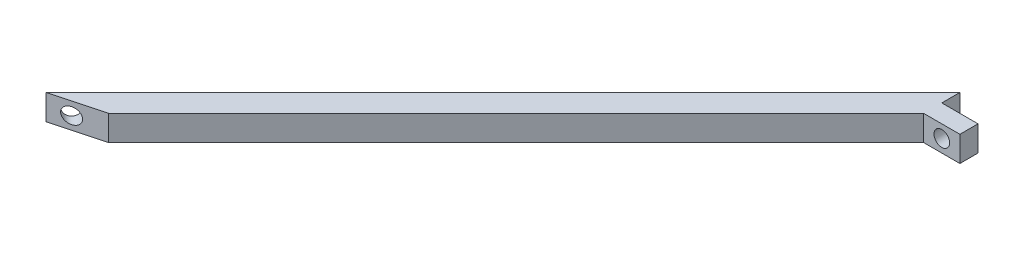
ISO-10303-21;
HEADER;
FILE_DESCRIPTION(('STEP AP214'),'2;1');
FILE_NAME('part.step','',(''),(''),'','','');
FILE_SCHEMA(('AUTOMOTIVE_DESIGN { 1 0 10303 214 1 1 1 1 }'));
ENDSEC;
DATA;
#1=APPLICATION_CONTEXT('core data for automotive mechanical design processes');
#2=APPLICATION_PROTOCOL_DEFINITION('international standard','automotive_design',2000,#1);
#3=PRODUCT_CONTEXT('',#1,'mechanical');
#4=PRODUCT('Part','Part','',(#3));
#5=PRODUCT_RELATED_PRODUCT_CATEGORY('part','',(#4));
#6=PRODUCT_DEFINITION_FORMATION('','',#4);
#7=PRODUCT_DEFINITION_CONTEXT('part definition',#1,'design');
#8=PRODUCT_DEFINITION('design','',#6,#7);
#9=PRODUCT_DEFINITION_SHAPE('','',#8);
#10=(LENGTH_UNIT() NAMED_UNIT(*) SI_UNIT(.MILLI.,.METRE.));
#11=(NAMED_UNIT(*) PLANE_ANGLE_UNIT() SI_UNIT($,.RADIAN.));
#12=(NAMED_UNIT(*) SI_UNIT($,.STERADIAN.) SOLID_ANGLE_UNIT());
#13=UNCERTAINTY_MEASURE_WITH_UNIT(LENGTH_MEASURE(1.E-05),#10,'distance_accuracy_value','');
#14=(GEOMETRIC_REPRESENTATION_CONTEXT(3) GLOBAL_UNCERTAINTY_ASSIGNED_CONTEXT((#13)) GLOBAL_UNIT_ASSIGNED_CONTEXT((#10,
#11,#12)) REPRESENTATION_CONTEXT('',''));
#15=CARTESIAN_POINT('',(0.,0.,0.));
#16=DIRECTION('',(0.,0.,1.));
#17=DIRECTION('',(1.,0.,0.));
#18=AXIS2_PLACEMENT_3D('',#15,#16,#17);
#19=CARTESIAN_POINT('',(-147.271192020746,-0.00999999999999959,110.472946406711));
#20=DIRECTION('',(0.258819045102527,0.,0.965925826289067));
#21=DIRECTION('',(0.965925826289067,0.,-0.258819045102527));
#22=AXIS2_PLACEMENT_3D('',#19,#20,#21);
#23=PLANE('',#22);
#24=DIRECTION('',(0.,-1.,0.));
#25=VECTOR('',#24,1.);
#26=CARTESIAN_POINT('',(-147.271192020746,7.,110.472946406711));
#27=LINE('',#26,#25);
#28=CARTESIAN_POINT('',(-147.271192020746,7.,110.472946406711));
#29=VERTEX_POINT('',#28);
#30=CARTESIAN_POINT('',(-147.271192020746,0.,110.472946406711));
#31=VERTEX_POINT('',#30);
#32=EDGE_CURVE('E113',#29,#31,#27,.T.);
#33=ORIENTED_EDGE('',*,*,#32,.T.);
#34=DIRECTION('',(0.965925826289067,0.,-0.258819045102527));
#35=VECTOR('',#34,1.);
#36=CARTESIAN_POINT('',(17.752937359096,0.,66.2548642077321));
#37=LINE('',#36,#35);
#38=CARTESIAN_POINT('',(-133.610937982901,0.,106.812692368866));
#39=VERTEX_POINT('',#38);
#40=EDGE_CURVE('E138',#31,#39,#37,.T.);
#41=ORIENTED_EDGE('',*,*,#40,.T.);
#42=DIRECTION('',(0.,-1.,0.));
#43=VECTOR('',#42,1.);
#44=CARTESIAN_POINT('',(-133.610937982901,7.,106.812692368866));
#45=LINE('',#44,#43);
#46=CARTESIAN_POINT('',(-133.610937982901,7.,106.812692368866));
#47=VERTEX_POINT('',#46);
#48=EDGE_CURVE('E132',#47,#39,#45,.T.);
#49=ORIENTED_EDGE('',*,*,#48,.F.);
#50=DIRECTION('',(0.965925826289067,0.,-0.258819045102527));
#51=VECTOR('',#50,1.);
#52=CARTESIAN_POINT('',(17.752937359096,7.,66.2548642077321));
#53=LINE('',#52,#51);
#54=EDGE_CURVE('E135',#29,#47,#53,.T.);
#55=ORIENTED_EDGE('',*,*,#54,.F.);
#56=EDGE_LOOP('',(#33,#41,#49,#55));
#57=FACE_BOUND('',#56,.T.);
#58=CARTESIAN_POINT('',(-141.694416662494,3.5,108.978653953098));
#59=DIRECTION('',(0.258819045102527,0.,0.965925826289067));
#60=DIRECTION('',(-0.965925826289067,0.,0.258819045102527));
#61=AXIS2_PLACEMENT_3D('',#58,#59,#60);
#62=ELLIPSE('',#61,2.4826061575154,2.15000000000001);
#63=CARTESIAN_POINT('',(-144.092430066542,3.5,109.621199708151));
#64=VERTEX_POINT('',#63);
#65=EDGE_CURVE('E141',#64,#64,#62,.F.);
#66=ORIENTED_EDGE('',*,*,#65,.T.);
#67=EDGE_LOOP('',(#66));
#68=FACE_BOUND('',#67,.T.);
#69=ADVANCED_FACE('F41',(#57,#68),#23,.T.);
#70=CARTESIAN_POINT('',(-18.3991228070176,7.,-18.3991228070176));
#71=DIRECTION('',(0.707106781186547,0.,0.707106781186547));
#72=DIRECTION('',(0.707106781186548,0.,-0.707106781186548));
#73=AXIS2_PLACEMENT_3D('',#70,#71,#72);
#74=PLANE('',#73);
#75=CARTESIAN_POINT('',(-143.735658114813,3.5,106.937412500778));
#76=DIRECTION('',(-0.707106781186548,0.,-0.707106781186547));
#77=DIRECTION('',(-0.707106781186547,0.,0.707106781186548));
#78=AXIS2_PLACEMENT_3D('',#75,#76,#77);
#79=CIRCLE('',#78,2.15000000000001);
#80=CARTESIAN_POINT('',(-145.255937694364,3.5,108.457692080329));
#81=VERTEX_POINT('',#80);
#82=EDGE_CURVE('E11',#81,#81,#79,.T.);
#83=ORIENTED_EDGE('',*,*,#82,.F.);
#84=EDGE_LOOP('',(#83));
#85=FACE_BOUND('',#84,.T.);
#86=ORIENTED_EDGE('',*,*,#32,.F.);
#87=DIRECTION('',(-0.707106781186548,0.,0.707106781186548));
#88=VECTOR('',#87,1.);
#89=CARTESIAN_POINT('',(-18.3991228070176,7.,-18.3991228070176));
#90=LINE('',#89,#88);
#91=CARTESIAN_POINT('',(-21.0526315789474,7.,-15.7456140350877));
#92=VERTEX_POINT('',#91);
#93=EDGE_CURVE('E109',#92,#29,#90,.T.);
#94=ORIENTED_EDGE('',*,*,#93,.F.);
#95=DIRECTION('',(0.,-1.,0.));
#96=VECTOR('',#95,1.);
#97=CARTESIAN_POINT('',(-21.0526315789474,7.,-15.7456140350877));
#98=LINE('',#97,#96);
#99=CARTESIAN_POINT('',(-21.0526315789474,0.,-15.7456140350877));
#100=VERTEX_POINT('',#99);
#101=EDGE_CURVE('E95',#92,#100,#98,.T.);
#102=ORIENTED_EDGE('',*,*,#101,.T.);
#103=DIRECTION('',(-0.707106781186548,0.,0.707106781186548));
#104=VECTOR('',#103,1.);
#105=CARTESIAN_POINT('',(-18.3991228070176,0.,-18.3991228070176));
#106=LINE('',#105,#104);
#107=EDGE_CURVE('E45',#100,#31,#106,.T.);
#108=ORIENTED_EDGE('',*,*,#107,.T.);
#109=EDGE_LOOP('',(#86,#94,#102,#108));
#110=FACE_BOUND('',#109,.T.);
#111=ADVANCED_FACE('F110',(#85,#110),#74,.F.);
#112=CARTESIAN_POINT('',(0.,0.,0.));
#113=DIRECTION('',(0.,1.,0.));
#114=DIRECTION('',(0.,0.,1.));
#115=AXIS2_PLACEMENT_3D('',#112,#113,#114);
#116=PLANE('',#115);
#117=ORIENTED_EDGE('',*,*,#40,.F.);
#118=ORIENTED_EDGE('',*,*,#107,.F.);
#119=DIRECTION('',(0.,0.,1.));
#120=VECTOR('',#119,1.);
#121=CARTESIAN_POINT('',(-21.0526315789474,0.,0.));
#122=LINE('',#121,#120);
#123=CARTESIAN_POINT('',(-21.0526315789474,0.,-10.7456140350877));
#124=VERTEX_POINT('',#123);
#125=EDGE_CURVE('E101',#100,#124,#122,.T.);
#126=ORIENTED_EDGE('',*,*,#125,.T.);
#127=DIRECTION('',(1.,0.,0.));
#128=VECTOR('',#127,1.);
#129=CARTESIAN_POINT('',(-21.0526315789474,0.,-10.7456140350877));
#130=LINE('',#129,#128);
#131=CARTESIAN_POINT('',(-11.0526315789474,0.,-10.7456140350877));
#132=VERTEX_POINT('',#131);
#133=EDGE_CURVE('E151',#124,#132,#130,.T.);
#134=ORIENTED_EDGE('',*,*,#133,.T.);
#135=DIRECTION('',(0.,0.,1.));
#136=VECTOR('',#135,1.);
#137=CARTESIAN_POINT('',(-11.0526315789474,0.,-10.7456140350877));
#138=LINE('',#137,#136);
#139=CARTESIAN_POINT('',(-11.0526315789474,0.,-5.74561403508773));
#140=VERTEX_POINT('',#139);
#141=EDGE_CURVE('E155',#132,#140,#138,.T.);
#142=ORIENTED_EDGE('',*,*,#141,.T.);
#143=DIRECTION('',(1.,0.,0.));
#144=VECTOR('',#143,1.);
#145=CARTESIAN_POINT('',(-21.0526315789474,0.,-5.74561403508773));
#146=LINE('',#145,#144);
#147=CARTESIAN_POINT('',(-21.0526315789474,0.,-5.74561403508771));
#148=VERTEX_POINT('',#147);
#149=EDGE_CURVE('E158',#148,#140,#146,.T.);
#150=ORIENTED_EDGE('',*,*,#149,.F.);
#151=DIRECTION('',(-0.707106781186546,0.,0.707106781186549));
#152=VECTOR('',#151,1.);
#153=CARTESIAN_POINT('',(-13.3991228070176,0.,-13.3991228070175));
#154=LINE('',#153,#152);
#155=EDGE_CURVE('E123',#148,#39,#154,.T.);
#156=ORIENTED_EDGE('',*,*,#155,.T.);
#157=EDGE_LOOP('',(#117,#118,#126,#134,#142,#150,#156));
#158=FACE_BOUND('',#157,.T.);
#159=ADVANCED_FACE('F186',(#158),#116,.F.);
#160=CARTESIAN_POINT('',(0.,7.,0.));
#161=DIRECTION('',(0.,1.,0.));
#162=DIRECTION('',(0.,0.,1.));
#163=AXIS2_PLACEMENT_3D('',#160,#161,#162);
#164=PLANE('',#163);
#165=ORIENTED_EDGE('',*,*,#93,.T.);
#166=ORIENTED_EDGE('',*,*,#54,.T.);
#167=DIRECTION('',(-0.707106781186546,0.,0.707106781186549));
#168=VECTOR('',#167,1.);
#169=CARTESIAN_POINT('',(-13.3991228070176,7.,-13.3991228070175));
#170=LINE('',#169,#168);
#171=CARTESIAN_POINT('',(-21.0526315789474,7.,-5.74561403508771));
#172=VERTEX_POINT('',#171);
#173=EDGE_CURVE('E116',#172,#47,#170,.T.);
#174=ORIENTED_EDGE('',*,*,#173,.F.);
#175=DIRECTION('',(1.,0.,0.));
#176=VECTOR('',#175,1.);
#177=CARTESIAN_POINT('',(-21.0526315789474,7.,-5.74561403508773));
#178=LINE('',#177,#176);
#179=CARTESIAN_POINT('',(-11.0526315789474,7.,-5.74561403508773));
#180=VERTEX_POINT('',#179);
#181=EDGE_CURVE('E152',#172,#180,#178,.T.);
#182=ORIENTED_EDGE('',*,*,#181,.T.);
#183=DIRECTION('',(0.,0.,1.));
#184=VECTOR('',#183,1.);
#185=CARTESIAN_POINT('',(-11.0526315789474,7.,-10.7456140350877));
#186=LINE('',#185,#184);
#187=CARTESIAN_POINT('',(-11.0526315789474,7.,-10.7456140350877));
#188=VERTEX_POINT('',#187);
#189=EDGE_CURVE('E149',#188,#180,#186,.T.);
#190=ORIENTED_EDGE('',*,*,#189,.F.);
#191=DIRECTION('',(1.,0.,0.));
#192=VECTOR('',#191,1.);
#193=CARTESIAN_POINT('',(-21.0526315789474,7.,-10.7456140350877));
#194=LINE('',#193,#192);
#195=CARTESIAN_POINT('',(-21.0526315789474,7.,-10.7456140350877));
#196=VERTEX_POINT('',#195);
#197=EDGE_CURVE('E122',#196,#188,#194,.T.);
#198=ORIENTED_EDGE('',*,*,#197,.F.);
#199=DIRECTION('',(0.,0.,1.));
#200=VECTOR('',#199,1.);
#201=CARTESIAN_POINT('',(-21.0526315789474,7.,0.));
#202=LINE('',#201,#200);
#203=EDGE_CURVE('E99',#92,#196,#202,.T.);
#204=ORIENTED_EDGE('',*,*,#203,.F.);
#205=EDGE_LOOP('',(#165,#166,#174,#182,#190,#198,#204));
#206=FACE_BOUND('',#205,.T.);
#207=ADVANCED_FACE('F119',(#206),#164,.T.);
#208=CARTESIAN_POINT('',(-13.3991228070176,7.,-13.3991228070175));
#209=DIRECTION('',(0.707106781186549,0.,0.707106781186546));
#210=DIRECTION('',(0.707106781186546,0.,-0.707106781186549));
#211=AXIS2_PLACEMENT_3D('',#208,#209,#210);
#212=PLANE('',#211);
#213=ORIENTED_EDGE('',*,*,#173,.T.);
#214=ORIENTED_EDGE('',*,*,#48,.T.);
#215=ORIENTED_EDGE('',*,*,#155,.F.);
#216=DIRECTION('',(0.,-1.,0.));
#217=VECTOR('',#216,1.);
#218=CARTESIAN_POINT('',(-21.0526315789474,7.,-5.74561403508771));
#219=LINE('',#218,#217);
#220=EDGE_CURVE('E89',#172,#148,#219,.T.);
#221=ORIENTED_EDGE('',*,*,#220,.F.);
#222=EDGE_LOOP('',(#213,#214,#215,#221));
#223=FACE_BOUND('',#222,.T.);
#224=ADVANCED_FACE('F199',(#223),#212,.T.);
#225=CARTESIAN_POINT('',(-136.664590302948,3.5,114.008480312644));
#226=DIRECTION('',(-0.707106781186548,0.,-0.707106781186547));
#227=DIRECTION('',(-0.707106781186547,0.,0.707106781186548));
#228=AXIS2_PLACEMENT_3D('',#225,#226,#227);
#229=CYLINDRICAL_SURFACE('',#228,2.15000000000001);
#230=ORIENTED_EDGE('',*,*,#82,.T.);
#231=EDGE_LOOP('',(#230));
#232=FACE_BOUND('',#231,.T.);
#233=ORIENTED_EDGE('',*,*,#65,.F.);
#234=EDGE_LOOP('',(#233));
#235=FACE_BOUND('',#234,.T.);
#236=ADVANCED_FACE('F43',(#232,#235),#229,.F.);
#237=CARTESIAN_POINT('',(-21.0526315789474,7.,0.));
#238=DIRECTION('',(1.,0.,0.));
#239=DIRECTION('',(0.,0.,-1.));
#240=AXIS2_PLACEMENT_3D('',#237,#238,#239);
#241=PLANE('',#240);
#242=ORIENTED_EDGE('',*,*,#203,.T.);
#243=DIRECTION('',(0.,-1.,0.));
#244=VECTOR('',#243,1.);
#245=CARTESIAN_POINT('',(-21.0526315789474,7.,-10.7456140350877));
#246=LINE('',#245,#244);
#247=EDGE_CURVE('E105',#196,#124,#246,.T.);
#248=ORIENTED_EDGE('',*,*,#247,.T.);
#249=ORIENTED_EDGE('',*,*,#125,.F.);
#250=ORIENTED_EDGE('',*,*,#101,.F.);
#251=EDGE_LOOP('',(#242,#248,#249,#250));
#252=FACE_BOUND('',#251,.T.);
#253=ADVANCED_FACE('F97',(#252),#241,.T.);
#254=CARTESIAN_POINT('',(-11.0526315789474,7.,-10.7456140350877));
#255=DIRECTION('',(1.,0.,0.));
#256=DIRECTION('',(0.,0.,-1.));
#257=AXIS2_PLACEMENT_3D('',#254,#255,#256);
#258=PLANE('',#257);
#259=ORIENTED_EDGE('',*,*,#141,.F.);
#260=DIRECTION('',(0.,-1.,0.));
#261=VECTOR('',#260,1.);
#262=CARTESIAN_POINT('',(-11.0526315789474,7.,-10.7456140350877));
#263=LINE('',#262,#261);
#264=EDGE_CURVE('E162',#188,#132,#263,.T.);
#265=ORIENTED_EDGE('',*,*,#264,.F.);
#266=ORIENTED_EDGE('',*,*,#189,.T.);
#267=DIRECTION('',(0.,-1.,0.));
#268=VECTOR('',#267,1.);
#269=CARTESIAN_POINT('',(-11.0526315789474,7.,-5.74561403508773));
#270=LINE('',#269,#268);
#271=EDGE_CURVE('E60',#180,#140,#270,.T.);
#272=ORIENTED_EDGE('',*,*,#271,.T.);
#273=EDGE_LOOP('',(#259,#265,#266,#272));
#274=FACE_BOUND('',#273,.T.);
#275=ADVANCED_FACE('F211',(#274),#258,.T.);
#276=CARTESIAN_POINT('',(-21.0526315789474,7.,-10.7456140350877));
#277=DIRECTION('',(0.,0.,-1.));
#278=DIRECTION('',(-1.,0.,0.));
#279=AXIS2_PLACEMENT_3D('',#276,#277,#278);
#280=PLANE('',#279);
#281=CARTESIAN_POINT('',(-16.0526315789474,3.5,-10.7456140350877));
#282=DIRECTION('',(0.,0.,-1.));
#283=DIRECTION('',(-1.,0.,0.));
#284=AXIS2_PLACEMENT_3D('',#281,#282,#283);
#285=CIRCLE('',#284,2.15);
#286=CARTESIAN_POINT('',(-18.2026315789474,3.5,-10.7456140350877));
#287=VERTEX_POINT('',#286);
#288=EDGE_CURVE('E51',#287,#287,#285,.T.);
#289=ORIENTED_EDGE('',*,*,#288,.F.);
#290=EDGE_LOOP('',(#289));
#291=FACE_BOUND('',#290,.T.);
#292=ORIENTED_EDGE('',*,*,#133,.F.);
#293=ORIENTED_EDGE('',*,*,#247,.F.);
#294=ORIENTED_EDGE('',*,*,#197,.T.);
#295=ORIENTED_EDGE('',*,*,#264,.T.);
#296=EDGE_LOOP('',(#292,#293,#294,#295));
#297=FACE_BOUND('',#296,.T.);
#298=ADVANCED_FACE('F179',(#291,#297),#280,.T.);
#299=CARTESIAN_POINT('',(-21.0526315789474,7.,-5.74561403508773));
#300=DIRECTION('',(0.,0.,-1.));
#301=DIRECTION('',(-1.,0.,0.));
#302=AXIS2_PLACEMENT_3D('',#299,#300,#301);
#303=PLANE('',#302);
#304=CARTESIAN_POINT('',(-16.0526315789474,3.5,-5.74561403508773));
#305=DIRECTION('',(0.,0.,-1.));
#306=DIRECTION('',(-1.,0.,0.));
#307=AXIS2_PLACEMENT_3D('',#304,#305,#306);
#308=CIRCLE('',#307,2.15);
#309=CARTESIAN_POINT('',(-18.2026315789474,3.5,-5.74561403508773));
#310=VERTEX_POINT('',#309);
#311=EDGE_CURVE('E130',#310,#310,#308,.T.);
#312=ORIENTED_EDGE('',*,*,#311,.T.);
#313=EDGE_LOOP('',(#312));
#314=FACE_BOUND('',#313,.T.);
#315=ORIENTED_EDGE('',*,*,#149,.T.);
#316=ORIENTED_EDGE('',*,*,#271,.F.);
#317=ORIENTED_EDGE('',*,*,#181,.F.);
#318=ORIENTED_EDGE('',*,*,#220,.T.);
#319=EDGE_LOOP('',(#315,#316,#317,#318));
#320=FACE_BOUND('',#319,.T.);
#321=ADVANCED_FACE('F169',(#314,#320),#303,.F.);
#322=CARTESIAN_POINT('',(-16.0526315789474,3.5,-3.74561403508773));
#323=DIRECTION('',(0.,0.,-1.));
#324=DIRECTION('',(-1.,0.,0.));
#325=AXIS2_PLACEMENT_3D('',#322,#323,#324);
#326=CYLINDRICAL_SURFACE('',#325,2.15);
#327=ORIENTED_EDGE('',*,*,#288,.T.);
#328=EDGE_LOOP('',(#327));
#329=FACE_BOUND('',#328,.T.);
#330=ORIENTED_EDGE('',*,*,#311,.F.);
#331=EDGE_LOOP('',(#330));
#332=FACE_BOUND('',#331,.T.);
#333=ADVANCED_FACE('F171',(#329,#332),#326,.F.);
#334=CLOSED_SHELL('',(#69,#111,#159,#207,#224,#236,#253,#275,#298,#321,#333));
#335=MANIFOLD_SOLID_BREP('B2',#334);
#336=ADVANCED_BREP_SHAPE_REPRESENTATION('',(#18,#335),#14);
#337=SHAPE_DEFINITION_REPRESENTATION(#9,#336);
ENDSEC;
END-ISO-10303-21;
